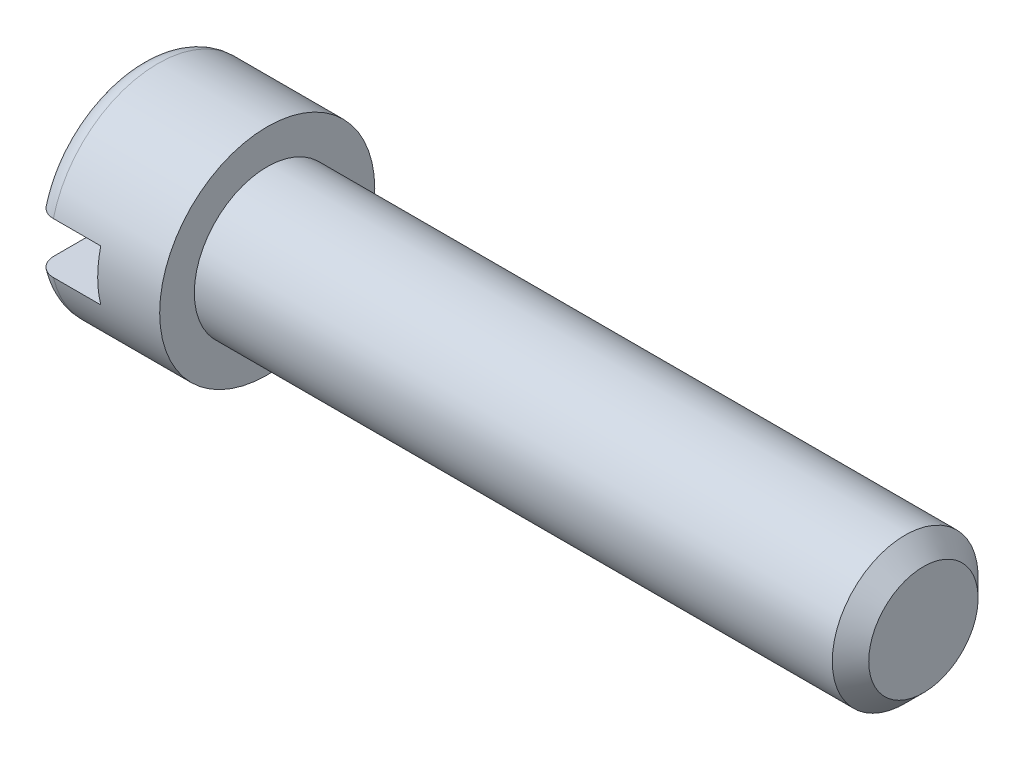
ISO-10303-21;
HEADER;
FILE_DESCRIPTION(('STEP AP214'),'2;1');
FILE_NAME('part.step','',(''),(''),'','','');
FILE_SCHEMA(('AUTOMOTIVE_DESIGN { 1 0 10303 214 1 1 1 1 }'));
ENDSEC;
DATA;
#1=APPLICATION_CONTEXT('core data for automotive mechanical design processes');
#2=APPLICATION_PROTOCOL_DEFINITION('international standard','automotive_design',2000,#1);
#3=PRODUCT_CONTEXT('',#1,'mechanical');
#4=PRODUCT('Part','Part','',(#3));
#5=PRODUCT_RELATED_PRODUCT_CATEGORY('part','',(#4));
#6=PRODUCT_DEFINITION_FORMATION('','',#4);
#7=PRODUCT_DEFINITION_CONTEXT('part definition',#1,'design');
#8=PRODUCT_DEFINITION('design','',#6,#7);
#9=PRODUCT_DEFINITION_SHAPE('','',#8);
#10=(LENGTH_UNIT() NAMED_UNIT(*) SI_UNIT(.MILLI.,.METRE.));
#11=(NAMED_UNIT(*) PLANE_ANGLE_UNIT() SI_UNIT($,.RADIAN.));
#12=(NAMED_UNIT(*) SI_UNIT($,.STERADIAN.) SOLID_ANGLE_UNIT());
#13=UNCERTAINTY_MEASURE_WITH_UNIT(LENGTH_MEASURE(1.E-05),#10,'distance_accuracy_value','');
#14=(GEOMETRIC_REPRESENTATION_CONTEXT(3) GLOBAL_UNCERTAINTY_ASSIGNED_CONTEXT((#13)) GLOBAL_UNIT_ASSIGNED_CONTEXT((#10,
#11,#12)) REPRESENTATION_CONTEXT('',''));
#15=CARTESIAN_POINT('',(0.,0.,0.));
#16=DIRECTION('',(0.,0.,1.));
#17=DIRECTION('',(1.,0.,0.));
#18=AXIS2_PLACEMENT_3D('',#15,#16,#17);
#19=CARTESIAN_POINT('',(-21.5,2.95,0.));
#20=DIRECTION('',(1.,0.,0.));
#21=DIRECTION('',(0.,0.,-1.));
#22=AXIS2_PLACEMENT_3D('',#19,#20,#21);
#23=PLANE('',#22);
#24=CARTESIAN_POINT('',(-21.5,0.,0.));
#25=DIRECTION('',(1.,0.,0.));
#26=DIRECTION('',(0.,0.,-1.));
#27=AXIS2_PLACEMENT_3D('',#24,#25,#26);
#28=CIRCLE('',#27,2.45);
#29=CARTESIAN_POINT('',(-21.5,0.7,2.34787137637478));
#30=VERTEX_POINT('',#29);
#31=CARTESIAN_POINT('',(-21.5,0.7,-2.34787137637655));
#32=VERTEX_POINT('',#31);
#33=EDGE_CURVE('E130',#30,#32,#28,.F.);
#34=ORIENTED_EDGE('',*,*,#33,.T.);
#35=DIRECTION('',(0.,0.,1.));
#36=VECTOR('',#35,1.);
#37=CARTESIAN_POINT('',(-21.5,0.7,-2.95));
#38=LINE('',#37,#36);
#39=EDGE_CURVE('E113',#32,#30,#38,.T.);
#40=ORIENTED_EDGE('',*,*,#39,.T.);
#41=EDGE_LOOP('',(#34,#40));
#42=FACE_BOUND('',#41,.T.);
#43=ADVANCED_FACE('F36',(#42),#23,.F.);
#44=CARTESIAN_POINT('',(-21.,0.,0.));
#45=DIRECTION('',(1.,0.,0.));
#46=DIRECTION('',(0.,0.,-1.));
#47=AXIS2_PLACEMENT_3D('',#44,#45,#46);
#48=TOROIDAL_SURFACE('',#47,2.45,0.5);
#49=CARTESIAN_POINT('',(-21.3395323476872,0.7,-2.72868282056212));
#50=CARTESIAN_POINT('',(-21.3194307837538,0.7,-2.74787857352715));
#51=CARTESIAN_POINT('',(-21.2977272761185,0.7,-2.76542091601088));
#52=CARTESIAN_POINT('',(-21.2516791558268,0.7,-2.79664650662874));
#53=CARTESIAN_POINT('',(-21.2273322587648,0.7,-2.81032637948368));
#54=CARTESIAN_POINT('',(-21.1766614029984,0.7,-2.83338291517071));
#55=CARTESIAN_POINT('',(-21.1503365433846,0.7,-2.84275760311003));
#56=CARTESIAN_POINT('',(-21.0964786974651,0.7,-2.85688232263212));
#57=CARTESIAN_POINT('',(-21.0689459798093,0.7,-2.86163337720094));
#58=CARTESIAN_POINT('',(-21.0138479143806,0.7,-2.86632433666586));
#59=CARTESIAN_POINT('',(-20.9862879941449,0.7,-2.86632814002665));
#60=CARTESIAN_POINT('',(-20.9315634946885,0.7,-2.86168448167034));
#61=CARTESIAN_POINT('',(-20.9043989068567,0.7,-2.85703712141773));
#62=CARTESIAN_POINT('',(-20.8513626771104,0.7,-2.84327486888603));
#63=CARTESIAN_POINT('',(-20.8254856253772,0.7,-2.83418078604609));
#64=CARTESIAN_POINT('',(-20.7756021868275,0.7,-2.81182333639531));
#65=CARTESIAN_POINT('',(-20.751595852723,0.7,-2.79855985215439));
#66=CARTESIAN_POINT('',(-20.7058367865334,0.7,-2.7681035815624));
#67=CARTESIAN_POINT('',(-20.6841119804118,0.7,-2.75086887526299));
#68=CARTESIAN_POINT('',(-20.6437788213491,0.7,-2.7130765153823));
#69=CARTESIAN_POINT('',(-20.6251707754391,0.7,-2.69251853481769));
#70=CARTESIAN_POINT('',(-20.59109996563,0.7,-2.64813478674737));
#71=CARTESIAN_POINT('',(-20.5757255841669,0.7,-2.62424121288317));
#72=CARTESIAN_POINT('',(-20.5490593985457,0.7,-2.57427711391345));
#73=CARTESIAN_POINT('',(-20.5377682158271,0.7,-2.54820625818074));
#74=CARTESIAN_POINT('',(-20.5191923460456,0.7,-2.49371427692626));
#75=CARTESIAN_POINT('',(-20.5120517543118,0.7,-2.4652440388772));
#76=CARTESIAN_POINT('',(-20.5024864012886,0.7,-2.40752257561004));
#77=CARTESIAN_POINT('',(-20.5000624687108,0.7,-2.37827121406452));
#78=CARTESIAN_POINT('',(-20.4999379414336,0.7,-2.31880749672026));
#79=CARTESIAN_POINT('',(-20.5023932055817,0.7,-2.28859476497083));
#80=CARTESIAN_POINT('',(-20.5122429138957,0.7,-2.2289830650535));
#81=CARTESIAN_POINT('',(-20.5196381228431,0.7,-2.19958422362273));
#82=CARTESIAN_POINT('',(-20.5393551261286,0.7,-2.14187892307388));
#83=CARTESIAN_POINT('',(-20.5517649428374,0.7,-2.11360245959055));
#84=CARTESIAN_POINT('',(-20.5812082576796,0.7,-2.05956201885381));
#85=CARTESIAN_POINT('',(-20.5982418986823,0.7,-2.03379811926829));
#86=CARTESIAN_POINT('',(-20.6362968024832,0.7,-1.98589654828779));
#87=CARTESIAN_POINT('',(-20.6572683495468,0.7,-1.96371947550884));
#88=CARTESIAN_POINT('',(-20.7028035506186,0.7,-1.92341714148615));
#89=CARTESIAN_POINT('',(-20.7273661616196,0.7,-1.90529070760594));
#90=CARTESIAN_POINT('',(-20.7781359932806,0.7,-1.87459150288935));
#91=CARTESIAN_POINT('',(-20.8042062470927,0.7,-1.86179255921855));
#92=CARTESIAN_POINT('',(-20.8582209742639,0.7,-1.84108607637963));
#93=CARTESIAN_POINT('',(-20.8861645570407,0.7,-1.83317623095359));
#94=CARTESIAN_POINT('',(-20.9412667375179,0.7,-1.82294634529363));
#95=CARTESIAN_POINT('',(-20.9683670413763,0.7,-1.82031092188374));
#96=CARTESIAN_POINT('',(-21.0226107224124,0.7,-1.81978763047455));
#97=CARTESIAN_POINT('',(-21.0497540892797,0.7,-1.82189875950374));
#98=CARTESIAN_POINT('',(-21.1024411701321,0.7,-1.83063455552979));
#99=CARTESIAN_POINT('',(-21.1280084118403,0.7,-1.83711871814403));
#100=CARTESIAN_POINT('',(-21.1777290115261,0.7,-1.85419393618837));
#101=CARTESIAN_POINT('',(-21.2018822576405,0.7,-1.86478531604244));
#102=CARTESIAN_POINT('',(-21.248707961427,0.7,-1.88997221154755));
#103=CARTESIAN_POINT('',(-21.2713343024807,0.7,-1.90465324106722));
#104=CARTESIAN_POINT('',(-21.3139740195708,0.7,-1.93741238017284));
#105=CARTESIAN_POINT('',(-21.3339867571356,0.7,-1.95549131720499));
#106=CARTESIAN_POINT('',(-21.3720427680048,0.7,-1.99562523344564));
#107=CARTESIAN_POINT('',(-21.3899091209776,0.7,-2.01784794598396));
#108=CARTESIAN_POINT('',(-21.4218892928628,0.7,-2.06484639141047));
#109=CARTESIAN_POINT('',(-21.4360020780751,0.7,-2.08962282497018));
#110=CARTESIAN_POINT('',(-21.460845982988,0.7,-2.14248329174338));
#111=CARTESIAN_POINT('',(-21.4713504434774,0.7,-2.17067405099914));
#112=CARTESIAN_POINT('',(-21.487612960069,0.7,-2.22839362334481));
#113=CARTESIAN_POINT('',(-21.4933703774415,0.7,-2.25792261593453));
#114=CARTESIAN_POINT('',(-21.5000616186658,0.7,-2.31828925455976));
#115=CARTESIAN_POINT('',(-21.5008686974227,0.7,-2.34914107004229));
#116=CARTESIAN_POINT('',(-21.497249836884,0.7,-2.41054750998412));
#117=CARTESIAN_POINT('',(-21.49282262201,0.7,-2.44110206017111));
#118=CARTESIAN_POINT('',(-21.4788445237946,0.7,-2.5007728724454));
#119=CARTESIAN_POINT('',(-21.4693326607225,0.7,-2.52989826776312));
#120=CARTESIAN_POINT('',(-21.445410817045,0.7,-2.58603649647397));
#121=CARTESIAN_POINT('',(-21.4310075523434,0.7,-2.6130521643048));
#122=CARTESIAN_POINT('',(-21.4036537934208,0.7,-2.65495884096308));
#123=CARTESIAN_POINT('',(-21.3920276494582,0.7,-2.67072929420983));
#124=CARTESIAN_POINT('',(-21.367043095561,0.7,-2.70083392510903));
#125=CARTESIAN_POINT('',(-21.3536847464581,0.7,-2.71516815316757));
#126=CARTESIAN_POINT('',(-21.3395323476872,0.7,-2.72868282056212));
#127=B_SPLINE_CURVE_WITH_KNOTS('',3,(#49,#50,#51,#52,#53,#54,#55,#56,#57,#58,#59,#60,#61,#62,
#63,#64,#65,#66,#67,#68,#69,#70,#71,#72,#73,#74,#75,#76,#77,#78,#79,#80,#81,#82,#83,#84,#85,#86,
#87,#88,#89,#90,#91,#92,#93,#94,#95,#96,#97,#98,#99,#100,#101,#102,#103,#104,#105,#106,#107,
#108,#109,#110,#111,#112,#113,#114,#115,#116,#117,#118,#119,#120,#121,#122,#123,#124,#125,#126),
.UNSPECIFIED.,.T.,.F.,(4,2,2,2,2,2,2,2,2,2,2,2,2,2,2,2,2,2,2,2,2,2,2,2,2,2,2,2,2,2,2,2,2,2,2,2,
2,2,4),(0.,0.0833151889056845,0.166702960327436,0.250128945627075,0.333536468598735,
0.415821305896837,0.498104348201658,0.580005961396093,0.66190988153438,0.744721558255947,
0.82754138794216,0.9123934373738,0.99725839537023,1.08491648135421,1.17258996737119,
1.26310907103304,1.35364219173033,1.44583872795775,1.53803811324442,1.62914345549601,
1.72022238901315,1.80689698993791,1.89353067394227,1.97480771355881,2.05606758052315,
2.13483366126801,2.21360596491476,2.29416813532614,2.3747499494256,2.45991809014058,
2.54510966119565,2.63495178871342,2.72480600280366,2.81695149407557,2.9091194455013,
3.00059003359859,3.09193553677371,3.15059521018248,3.20925282413626),.UNSPECIFIED.);
#128=CARTESIAN_POINT('',(-21.0000000000001,0.7,-2.86574597618171));
#129=VERTEX_POINT('',#128);
#130=EDGE_CURVE('E59',#32,#129,#127,.T.);
#131=ORIENTED_EDGE('',*,*,#130,.F.);
#132=ORIENTED_EDGE('',*,*,#33,.F.);
#133=CARTESIAN_POINT('',(-21.089826393622,0.7,1.82874069125799));
#134=CARTESIAN_POINT('',(-21.0638941866123,0.7,1.82367114326781));
#135=CARTESIAN_POINT('',(-21.0375170439311,0.7,1.82078809255617));
#136=CARTESIAN_POINT('',(-20.9846391264482,0.7,1.81952985840892));
#137=CARTESIAN_POINT('',(-20.9581382620986,0.7,1.82115871335275));
#138=CARTESIAN_POINT('',(-20.9058170419438,0.7,1.82885572118953));
#139=CARTESIAN_POINT('',(-20.8799960412812,0.7,1.83491949789685));
#140=CARTESIAN_POINT('',(-20.829720580569,0.7,1.85123248058482));
#141=CARTESIAN_POINT('',(-20.8052660440476,0.7,1.86148145208113));
#142=CARTESIAN_POINT('',(-20.7579790608311,0.7,1.88596502576302));
#143=CARTESIAN_POINT('',(-20.7351765126615,0.7,1.90025720769797));
#144=CARTESIAN_POINT('',(-20.6921273567343,0.7,1.93227398227393));
#145=CARTESIAN_POINT('',(-20.6718813517706,0.7,1.94999938192817));
#146=CARTESIAN_POINT('',(-20.6333077126354,0.7,1.9894345417483));
#147=CARTESIAN_POINT('',(-20.6151517858165,0.7,2.01131221419429));
#148=CARTESIAN_POINT('',(-20.5825379806424,0.7,2.05766886707236));
#149=CARTESIAN_POINT('',(-20.5680811404062,0.7,2.08214857502269));
#150=CARTESIAN_POINT('',(-20.5424690684227,0.7,2.13447745833185));
#151=CARTESIAN_POINT('',(-20.5315414003752,0.7,2.16243820804652));
#152=CARTESIAN_POINT('',(-20.5143916432529,0.7,2.21976903361462));
#153=CARTESIAN_POINT('',(-20.5081703861676,0.7,2.24913935767422));
#154=CARTESIAN_POINT('',(-20.500500159442,0.7,2.30931718977685));
#155=CARTESIAN_POINT('',(-20.499186202819,0.7,2.34014204049858));
#156=CARTESIAN_POINT('',(-20.5017855195656,0.7,2.40157345242899));
#157=CARTESIAN_POINT('',(-20.5056988278809,0.7,2.43218001217696));
#158=CARTESIAN_POINT('',(-20.5186671379809,0.7,2.49207637300488));
#159=CARTESIAN_POINT('',(-20.5276880497479,0.7,2.52137352872421));
#160=CARTESIAN_POINT('',(-20.5506655608881,0.7,2.57796664121073));
#161=CARTESIAN_POINT('',(-20.5646214508813,0.7,2.60526288491918));
#162=CARTESIAN_POINT('',(-20.5966557287484,0.7,2.6562222051277));
#163=CARTESIAN_POINT('',(-20.6146031871926,0.7,2.67996753756022));
#164=CARTESIAN_POINT('',(-20.6543623013364,0.7,2.72396855918151));
#165=CARTESIAN_POINT('',(-20.6761731775773,0.7,2.74422495065411));
#166=CARTESIAN_POINT('',(-20.7222160456451,0.7,2.7799227465911));
#167=CARTESIAN_POINT('',(-20.7463367786237,0.7,2.79550769060097));
#168=CARTESIAN_POINT('',(-20.7969118462113,0.7,2.82226795625665));
#169=CARTESIAN_POINT('',(-20.8233657683122,0.7,2.83344405548203));
#170=CARTESIAN_POINT('',(-20.877042298006,0.7,2.85075417451028));
#171=CARTESIAN_POINT('',(-20.9042216038308,0.7,2.85702263579961));
#172=CARTESIAN_POINT('',(-20.9592505812763,0.7,2.86482979913505));
#173=CARTESIAN_POINT('',(-20.9871001813064,0.7,2.86636900404947));
#174=CARTESIAN_POINT('',(-21.0422317825662,0.7,2.86468011066848));
#175=CARTESIAN_POINT('',(-21.0695160088948,0.7,2.86152357257875));
#176=CARTESIAN_POINT('',(-21.1231664042162,0.7,2.85067678922464));
#177=CARTESIAN_POINT('',(-21.1495325946432,0.7,2.84298664988538));
#178=CARTESIAN_POINT('',(-21.200631487854,0.7,2.82331119012339));
#179=CARTESIAN_POINT('',(-21.2253629157891,0.7,2.81132256331025));
#180=CARTESIAN_POINT('',(-21.2725042181886,0.7,2.78342594128265));
#181=CARTESIAN_POINT('',(-21.2949139633433,0.7,2.7675177279275));
#182=CARTESIAN_POINT('',(-21.3371738563963,0.7,2.7319781220664));
#183=CARTESIAN_POINT('',(-21.3569772096004,0.7,2.71229112898305));
#184=CARTESIAN_POINT('',(-21.3931059690982,0.7,2.66995203961548));
#185=CARTESIAN_POINT('',(-21.4094309639907,0.7,2.64729959310463));
#186=CARTESIAN_POINT('',(-21.4386384451672,0.7,2.59899993374985));
#187=CARTESIAN_POINT('',(-21.4514112722165,0.7,2.57328644100231));
#188=CARTESIAN_POINT('',(-21.472619138679,0.7,2.52013026789535));
#189=CARTESIAN_POINT('',(-21.4810534563954,0.7,2.49268730069524));
#190=CARTESIAN_POINT('',(-21.4936441741993,0.7,2.43585748258088));
#191=CARTESIAN_POINT('',(-21.4976455002529,0.7,2.40643626571619));
#192=CARTESIAN_POINT('',(-21.500805562076,0.7,2.34733467110137));
#193=CARTESIAN_POINT('',(-21.4999634535874,0.7,2.31765424906958));
#194=CARTESIAN_POINT('',(-21.4934015190102,0.7,2.25794992027348));
#195=CARTESIAN_POINT('',(-21.4875387054062,0.7,2.22794165989663));
#196=CARTESIAN_POINT('',(-21.4709120247252,0.7,2.16931232092042));
#197=CARTESIAN_POINT('',(-21.4601476890242,0.7,2.14069137524883));
#198=CARTESIAN_POINT('',(-21.4338520995109,0.7,2.08538283795689));
#199=CARTESIAN_POINT('',(-21.4182755706642,0.7,2.05871671943311));
#200=CARTESIAN_POINT('',(-21.3827563321863,0.7,2.00845129202553));
#201=CARTESIAN_POINT('',(-21.3628127354621,0.7,1.98485260779144));
#202=CARTESIAN_POINT('',(-21.3195913190517,0.7,1.94207560327021));
#203=CARTESIAN_POINT('',(-21.2964055695536,0.7,1.92280435773701));
#204=CARTESIAN_POINT('',(-21.2469830209182,0.7,1.8887323578478));
#205=CARTESIAN_POINT('',(-21.2207516429712,0.7,1.87392382390311));
#206=CARTESIAN_POINT('',(-21.1768320297312,0.7,1.85423890376939));
#207=CARTESIAN_POINT('',(-21.1598506969167,0.7,1.84774819023773));
#208=CARTESIAN_POINT('',(-21.1252583985586,0.7,1.83674106812322));
#209=CARTESIAN_POINT('',(-21.1076474605111,0.7,1.83222457343572));
#210=CARTESIAN_POINT('',(-21.089826393622,0.7,1.82874069125799));
#211=B_SPLINE_CURVE_WITH_KNOTS('',3,(#133,#134,#135,#136,#137,#138,#139,#140,#141,#142,#143,
#144,#145,#146,#147,#148,#149,#150,#151,#152,#153,#154,#155,#156,#157,#158,#159,#160,#161,#162,
#163,#164,#165,#166,#167,#168,#169,#170,#171,#172,#173,#174,#175,#176,#177,#178,#179,#180,#181,
#182,#183,#184,#185,#186,#187,#188,#189,#190,#191,#192,#193,#194,#195,#196,#197,#198,#199,#200,
#201,#202,#203,#204,#205,#206,#207,#208,#209,#210),.UNSPECIFIED.,.T.,.F.,(4,2,2,2,2,2,2,2,2,2,2,
2,2,2,2,2,2,2,2,2,2,2,2,2,2,2,2,2,2,2,2,2,2,2,2,2,2,2,4),(0.,0.0792027395545826,
0.158476392391952,0.237671926834172,0.316863024788417,0.397244170539657,0.477644233688257,
0.562561804991983,0.647503181659748,0.737155233494773,0.826823130130588,0.918940590361569,
1.01105866642423,1.10256904030007,1.19406626533137,1.28291674929955,1.37174932772957,
1.45747723413869,1.54319001411282,1.62646348172795,1.70972809445436,1.79173673644564,
1.87374346242572,1.9558134036663,2.03788791345998,2.12127822591127,2.2046783958437,
2.29042276785905,2.37618139856129,2.46485360880836,2.55354127595886,2.64484206411412,
2.73615158317675,2.82834778108,2.9205627244222,3.01055245484003,3.100384391599,3.15481627580568,
3.20924578575346),.UNSPECIFIED.);
#212=CARTESIAN_POINT('',(-21.,0.7,2.86574597618142));
#213=VERTEX_POINT('',#212);
#214=EDGE_CURVE('E159',#213,#30,#211,.T.);
#215=ORIENTED_EDGE('',*,*,#214,.F.);
#216=CARTESIAN_POINT('',(-21.,0.,0.));
#217=DIRECTION('',(1.,0.,0.));
#218=DIRECTION('',(0.,0.,-1.));
#219=AXIS2_PLACEMENT_3D('',#216,#217,#218);
#220=CIRCLE('',#219,2.95);
#221=EDGE_CURVE('E135',#129,#213,#220,.T.);
#222=ORIENTED_EDGE('',*,*,#221,.F.);
#223=EDGE_LOOP('',(#131,#132,#215,#222));
#224=FACE_BOUND('',#223,.T.);
#225=ADVANCED_FACE('F177',(#224),#48,.T.);
#226=CARTESIAN_POINT('',(0.,0.,0.));
#227=DIRECTION('',(-1.,0.,0.));
#228=DIRECTION('',(0.,0.,1.));
#229=AXIS2_PLACEMENT_3D('',#226,#227,#228);
#230=PLANE('',#229);
#231=CARTESIAN_POINT('',(0.,0.,0.));
#232=DIRECTION('',(-1.,0.,0.));
#233=DIRECTION('',(0.,0.,1.));
#234=AXIS2_PLACEMENT_3D('',#231,#232,#233);
#235=CIRCLE('',#234,1.5);
#236=CARTESIAN_POINT('',(0.,0.,1.5));
#237=VERTEX_POINT('',#236);
#238=EDGE_CURVE('E127',#237,#237,#235,.F.);
#239=ORIENTED_EDGE('',*,*,#238,.T.);
#240=EDGE_LOOP('',(#239));
#241=FACE_BOUND('',#240,.T.);
#242=ADVANCED_FACE('F38',(#241),#230,.F.);
#243=CARTESIAN_POINT('',(-6.,0.,0.));
#244=DIRECTION('',(-1.,0.,0.));
#245=DIRECTION('',(0.,0.,1.));
#246=AXIS2_PLACEMENT_3D('',#243,#244,#245);
#247=CYLINDRICAL_SURFACE('',#246,2.);
#248=CARTESIAN_POINT('',(-0.500000000000002,0.,0.));
#249=DIRECTION('',(-1.,0.,0.));
#250=DIRECTION('',(0.,0.,1.));
#251=AXIS2_PLACEMENT_3D('',#248,#249,#250);
#252=CIRCLE('',#251,2.);
#253=CARTESIAN_POINT('',(-0.500000000000002,0.,2.));
#254=VERTEX_POINT('',#253);
#255=EDGE_CURVE('E124',#254,#254,#252,.T.);
#256=ORIENTED_EDGE('',*,*,#255,.T.);
#257=EDGE_LOOP('',(#256));
#258=FACE_BOUND('',#257,.T.);
#259=CARTESIAN_POINT('',(-18.,0.,0.));
#260=DIRECTION('',(-1.,0.,0.));
#261=DIRECTION('',(0.,0.,1.));
#262=AXIS2_PLACEMENT_3D('',#259,#260,#261);
#263=CIRCLE('',#262,2.);
#264=CARTESIAN_POINT('',(-18.,0.,2.));
#265=VERTEX_POINT('',#264);
#266=EDGE_CURVE('E121',#265,#265,#263,.T.);
#267=ORIENTED_EDGE('',*,*,#266,.F.);
#268=EDGE_LOOP('',(#267));
#269=FACE_BOUND('',#268,.T.);
#270=ADVANCED_FACE('F184',(#258,#269),#247,.T.);
#271=CARTESIAN_POINT('',(-18.,2.,0.));
#272=DIRECTION('',(-1.,0.,0.));
#273=DIRECTION('',(0.,0.,1.));
#274=AXIS2_PLACEMENT_3D('',#271,#272,#273);
#275=PLANE('',#274);
#276=CARTESIAN_POINT('',(-18.,0.,0.));
#277=DIRECTION('',(-1.,0.,0.));
#278=DIRECTION('',(0.,0.,1.));
#279=AXIS2_PLACEMENT_3D('',#276,#277,#278);
#280=CIRCLE('',#279,2.95);
#281=CARTESIAN_POINT('',(-18.,0.,2.95));
#282=VERTEX_POINT('',#281);
#283=EDGE_CURVE('E118',#282,#282,#280,.T.);
#284=ORIENTED_EDGE('',*,*,#283,.F.);
#285=EDGE_LOOP('',(#284));
#286=FACE_BOUND('',#285,.T.);
#287=ORIENTED_EDGE('',*,*,#266,.T.);
#288=EDGE_LOOP('',(#287));
#289=FACE_BOUND('',#288,.T.);
#290=ADVANCED_FACE('F201',(#286,#289),#275,.F.);
#291=CARTESIAN_POINT('',(-6.,0.,0.));
#292=DIRECTION('',(-1.,0.,0.));
#293=DIRECTION('',(0.,0.,1.));
#294=AXIS2_PLACEMENT_3D('',#291,#292,#293);
#295=CYLINDRICAL_SURFACE('',#294,2.95);
#296=CARTESIAN_POINT('',(-19.7,0.,0.));
#297=DIRECTION('',(1.,0.,0.));
#298=DIRECTION('',(0.,0.,-1.));
#299=AXIS2_PLACEMENT_3D('',#296,#297,#298);
#300=CIRCLE('',#299,2.95);
#301=CARTESIAN_POINT('',(-19.7,-0.7,-2.86574597618142));
#302=VERTEX_POINT('',#301);
#303=CARTESIAN_POINT('',(-19.7,0.7,-2.86574597618142));
#304=VERTEX_POINT('',#303);
#305=EDGE_CURVE('E11',#302,#304,#300,.T.);
#306=ORIENTED_EDGE('',*,*,#305,.T.);
#307=DIRECTION('',(-1.,0.,0.));
#308=VECTOR('',#307,1.);
#309=CARTESIAN_POINT('',(-6.,0.7,-2.86574597618142));
#310=LINE('',#309,#308);
#311=EDGE_CURVE('E111',#304,#129,#310,.T.);
#312=ORIENTED_EDGE('',*,*,#311,.T.);
#313=ORIENTED_EDGE('',*,*,#221,.T.);
#314=DIRECTION('',(-1.,0.,0.));
#315=VECTOR('',#314,1.);
#316=CARTESIAN_POINT('',(-6.,0.7,2.86574597618142));
#317=LINE('',#316,#315);
#318=CARTESIAN_POINT('',(-19.7,0.7,2.86574597618142));
#319=VERTEX_POINT('',#318);
#320=EDGE_CURVE('E108',#213,#319,#317,.F.);
#321=ORIENTED_EDGE('',*,*,#320,.T.);
#322=CARTESIAN_POINT('',(-19.7,-0.7,2.86574597618142));
#323=VERTEX_POINT('',#322);
#324=EDGE_CURVE('E40',#319,#323,#300,.T.);
#325=ORIENTED_EDGE('',*,*,#324,.T.);
#326=DIRECTION('',(-1.,0.,0.));
#327=VECTOR('',#326,1.);
#328=CARTESIAN_POINT('',(-6.,-0.7,2.86574597618142));
#329=LINE('',#328,#327);
#330=CARTESIAN_POINT('',(-20.9999999999998,-0.7,2.86574597618253));
#331=VERTEX_POINT('',#330);
#332=EDGE_CURVE('E101',#323,#331,#329,.T.);
#333=ORIENTED_EDGE('',*,*,#332,.T.);
#334=CARTESIAN_POINT('',(-20.9999999999998,-0.7,-2.86574597618241));
#335=VERTEX_POINT('',#334);
#336=EDGE_CURVE('E107',#331,#335,#220,.T.);
#337=ORIENTED_EDGE('',*,*,#336,.T.);
#338=DIRECTION('',(-1.,0.,0.));
#339=VECTOR('',#338,1.);
#340=CARTESIAN_POINT('',(-6.,-0.7,-2.86574597618142));
#341=LINE('',#340,#339);
#342=EDGE_CURVE('E98',#335,#302,#341,.F.);
#343=ORIENTED_EDGE('',*,*,#342,.T.);
#344=EDGE_LOOP('',(#306,#312,#313,#321,#325,#333,#337,#343));
#345=FACE_BOUND('',#344,.T.);
#346=ORIENTED_EDGE('',*,*,#283,.T.);
#347=EDGE_LOOP('',(#346));
#348=FACE_BOUND('',#347,.T.);
#349=ADVANCED_FACE('F104',(#345,#348),#295,.T.);
#350=CARTESIAN_POINT('',(-21.5,-0.7,-2.34787137637388));
#351=VERTEX_POINT('',#350);
#352=CARTESIAN_POINT('',(-21.5,-0.7,2.34787137637478));
#353=VERTEX_POINT('',#352);
#354=EDGE_CURVE('E131',#351,#353,#28,.F.);
#355=ORIENTED_EDGE('',*,*,#354,.T.);
#356=DIRECTION('',(0.,0.,1.));
#357=VECTOR('',#356,1.);
#358=CARTESIAN_POINT('',(-21.5,-0.7,-2.95));
#359=LINE('',#358,#357);
#360=EDGE_CURVE('E51',#351,#353,#359,.T.);
#361=ORIENTED_EDGE('',*,*,#360,.F.);
#362=EDGE_LOOP('',(#355,#361));
#363=FACE_BOUND('',#362,.T.);
#364=ADVANCED_FACE('F169',(#363),#23,.F.);
#365=CARTESIAN_POINT('',(-0.500000000000002,0.,0.));
#366=DIRECTION('',(-1.,0.,0.));
#367=DIRECTION('',(0.,0.,1.));
#368=AXIS2_PLACEMENT_3D('',#365,#366,#367);
#369=CONICAL_SURFACE('',#368,2.,0.785398163397447);
#370=ORIENTED_EDGE('',*,*,#238,.F.);
#371=EDGE_LOOP('',(#370));
#372=FACE_BOUND('',#371,.T.);
#373=ORIENTED_EDGE('',*,*,#255,.F.);
#374=EDGE_LOOP('',(#373));
#375=FACE_BOUND('',#374,.T.);
#376=ADVANCED_FACE('F188',(#372,#375),#369,.T.);
#377=CARTESIAN_POINT('',(-21.3395323476872,-0.7,-2.72868282056212));
#378=CARTESIAN_POINT('',(-21.3605464456769,-0.7,-2.7086120212581));
#379=CARTESIAN_POINT('',(-21.3798408236034,-0.7,-2.68670288461082));
#380=CARTESIAN_POINT('',(-21.4144593628447,-0.7,-2.63991302187431));
#381=CARTESIAN_POINT('',(-21.4297770440747,-0.7,-2.61502754096451));
#382=CARTESIAN_POINT('',(-21.4560303475647,-0.7,-2.56310586238075));
#383=CARTESIAN_POINT('',(-21.466974468195,-0.7,-2.53607395926461));
#384=CARTESIAN_POINT('',(-21.4842956684764,-0.7,-2.48059834494624));
#385=CARTESIAN_POINT('',(-21.4906739338359,-0.7,-2.45215500233433));
#386=CARTESIAN_POINT('',(-21.4988769520162,-0.7,-2.39385486471033));
#387=CARTESIAN_POINT('',(-21.5005773197024,-0.7,-2.36398057358289));
#388=CARTESIAN_POINT('',(-21.4990778062914,-0.7,-2.30435251875371));
#389=CARTESIAN_POINT('',(-21.4958768327529,-0.7,-2.27459878340432));
#390=CARTESIAN_POINT('',(-21.4845347629762,-0.7,-2.21523141874791));
#391=CARTESIAN_POINT('',(-21.476265620807,-0.7,-2.18564217437633));
#392=CARTESIAN_POINT('',(-21.4548938946718,-0.7,-2.12825904559643));
#393=CARTESIAN_POINT('',(-21.4417908189074,-0.7,-2.1004653442027));
#394=CARTESIAN_POINT('',(-21.4110221729413,-0.7,-2.04742435161519));
#395=CARTESIAN_POINT('',(-21.3933446103182,-0.7,-2.0221839998892));
#396=CARTESIAN_POINT('',(-21.353866941993,-0.7,-1.97515631010048));
#397=CARTESIAN_POINT('',(-21.3320674114008,-0.7,-1.95336849110819));
#398=CARTESIAN_POINT('',(-21.2857068432784,-0.7,-1.91471446905947));
#399=CARTESIAN_POINT('',(-21.2612638865645,-0.7,-1.89770693926839));
#400=CARTESIAN_POINT('',(-21.2097226773471,-0.7,-1.8683514633525));
#401=CARTESIAN_POINT('',(-21.1826256267265,-0.7,-1.85600142030295));
#402=CARTESIAN_POINT('',(-21.1283284594494,-0.7,-1.83711784835219));
#403=CARTESIAN_POINT('',(-21.1012359016612,-0.7,-1.83027490640679));
#404=CARTESIAN_POINT('',(-21.0462693144958,-0.7,-1.82149749716854));
#405=CARTESIAN_POINT('',(-21.0183955647358,-0.7,-1.81956129569869));
#406=CARTESIAN_POINT('',(-20.9641151648518,-0.7,-1.82065655705712));
#407=CARTESIAN_POINT('',(-20.937703368356,-0.7,-1.82344994824601));
#408=CARTESIAN_POINT('',(-20.8857275535363,-0.7,-1.83343376649581));
#409=CARTESIAN_POINT('',(-20.8601635130759,-0.7,-1.84062407864928));
#410=CARTESIAN_POINT('',(-20.8105629302657,-0.7,-1.85911647016737));
#411=CARTESIAN_POINT('',(-20.7865270483748,-0.7,-1.87042031336882));
#412=CARTESIAN_POINT('',(-20.7405773512116,-0.7,-1.89672831441139));
#413=CARTESIAN_POINT('',(-20.71866393655,-0.7,-1.91173316892158));
#414=CARTESIAN_POINT('',(-20.6764731550963,-0.7,-1.94574050777362));
#415=CARTESIAN_POINT('',(-20.6563200682295,-0.7,-1.96489701791975));
#416=CARTESIAN_POINT('',(-20.6192917238462,-0.7,-2.00615036508916));
#417=CARTESIAN_POINT('',(-20.6024173781589,-0.7,-2.02824801718334));
#418=CARTESIAN_POINT('',(-20.5713802109367,-0.7,-2.07617778561887));
#419=CARTESIAN_POINT('',(-20.5574400857697,-0.7,-2.10215424784234));
#420=CARTESIAN_POINT('',(-20.5339245349137,-0.7,-2.15601387513546));
#421=CARTESIAN_POINT('',(-20.5243501061583,-0.7,-2.18389747404144));
#422=CARTESIAN_POINT('',(-20.5094996882874,-0.7,-2.24197261534288));
#423=CARTESIAN_POINT('',(-20.5044094247032,-0.7,-2.27221183579763));
#424=CARTESIAN_POINT('',(-20.4993451885311,-0.7,-2.33311832182955));
#425=CARTESIAN_POINT('',(-20.4993715928674,-0.7,-2.36378561877497));
#426=CARTESIAN_POINT('',(-20.5046044534529,-0.7,-2.42484452070928));
#427=CARTESIAN_POINT('',(-20.5098385578577,-0.7,-2.4552337804703));
#428=CARTESIAN_POINT('',(-20.5254529289567,-0.7,-2.51466306381433));
#429=CARTESIAN_POINT('',(-20.5358326915426,-0.7,-2.5437032192613));
#430=CARTESIAN_POINT('',(-20.5612223674773,-0.7,-2.59889410789743));
#431=CARTESIAN_POINT('',(-20.5761226673367,-0.7,-2.62509520746191));
#432=CARTESIAN_POINT('',(-20.6102596711761,-0.7,-2.67450375621757));
#433=CARTESIAN_POINT('',(-20.6294955539863,-0.7,-2.69771177099918));
#434=CARTESIAN_POINT('',(-20.6710455126882,-0.7,-2.73961833030565));
#435=CARTESIAN_POINT('',(-20.6932306187785,-0.7,-2.75844474674859));
#436=CARTESIAN_POINT('',(-20.7405346417789,-0.7,-2.79195791506943));
#437=CARTESIAN_POINT('',(-20.7656529975194,-0.7,-2.80664545694003));
#438=CARTESIAN_POINT('',(-20.8172414048102,-0.7,-2.83098143296905));
#439=CARTESIAN_POINT('',(-20.8436426419947,-0.7,-2.84077585523816));
#440=CARTESIAN_POINT('',(-20.8977329431715,-0.7,-2.85568773058528));
#441=CARTESIAN_POINT('',(-20.925421776325,-0.7,-2.86080601862435));
#442=CARTESIAN_POINT('',(-20.9806880266126,-0.7,-2.86613868486456));
#443=CARTESIAN_POINT('',(-21.008255925948,-0.7,-2.86645219805462));
#444=CARTESIAN_POINT('',(-21.0630557272255,-0.7,-2.86241895281727));
#445=CARTESIAN_POINT('',(-21.0902875555867,-0.7,-2.85807119151901));
#446=CARTESIAN_POINT('',(-21.1435017392849,-0.7,-2.84488927109378));
#447=CARTESIAN_POINT('',(-21.1694893610221,-0.7,-2.83607627324785));
#448=CARTESIAN_POINT('',(-21.2196131421646,-0.7,-2.81426044397011));
#449=CARTESIAN_POINT('',(-21.2437515960254,-0.7,-2.80126291249125));
#450=CARTESIAN_POINT('',(-21.2796559851953,-0.7,-2.77792767103296));
#451=CARTESIAN_POINT('',(-21.2922669682521,-0.7,-2.76886158049539));
#452=CARTESIAN_POINT('',(-21.3165929460111,-0.7,-2.74959940556325));
#453=CARTESIAN_POINT('',(-21.3283079658141,-0.7,-2.7394033528446));
#454=CARTESIAN_POINT('',(-21.3395323476872,-0.7,-2.72868282056212));
#455=B_SPLINE_CURVE_WITH_KNOTS('',3,(#377,#378,#379,#380,#381,#382,#383,#384,#385,#386,#387,
#388,#389,#390,#391,#392,#393,#394,#395,#396,#397,#398,#399,#400,#401,#402,#403,#404,#405,#406,
#407,#408,#409,#410,#411,#412,#413,#414,#415,#416,#417,#418,#419,#420,#421,#422,#423,#424,#425,
#426,#427,#428,#429,#430,#431,#432,#433,#434,#435,#436,#437,#438,#439,#440,#441,#442,#443,#444,
#445,#446,#447,#448,#449,#450,#451,#452,#453,#454),.UNSPECIFIED.,.T.,.F.,(4,2,2,2,2,2,2,2,2,2,2,
2,2,2,2,2,2,2,2,2,2,2,2,2,2,2,2,2,2,2,2,2,2,2,2,2,2,2,4),(0.,0.0871182519997585,
0.174377585831457,0.261466529762529,0.348532849327236,0.437892859038912,0.527272788762146,
0.619009681812951,0.710755910639427,0.802745140933667,0.894721546062218,0.983592684418184,
1.07242376271311,1.1558245946156,1.23919594625748,1.31849422982148,1.3977904411234,
1.47712069390881,1.55646589103296,1.63951835594094,1.72259388506922,1.81064091152063,
1.89870803399614,1.99027120042019,2.08184111193467,2.17389978458026,2.26594944022811,
2.35592472210382,2.44588297674507,2.53274019107228,2.61958081559623,2.70364726973866,
2.7876987102099,2.87001356052373,2.95234612439079,3.0342921040369,3.1161347000163,
3.16266898069885,3.20920195722905),.UNSPECIFIED.);
#456=EDGE_CURVE('E142',#335,#351,#455,.T.);
#457=ORIENTED_EDGE('',*,*,#456,.F.);
#458=ORIENTED_EDGE('',*,*,#336,.F.);
#459=CARTESIAN_POINT('',(-21.089826393622,-0.7,1.82874069125799));
#460=CARTESIAN_POINT('',(-21.1168185890736,-0.7,1.83402062324525));
#461=CARTESIAN_POINT('',(-21.1433712032588,-0.7,1.84167865984696));
#462=CARTESIAN_POINT('',(-21.1947997249542,-0.7,1.86142953189058));
#463=CARTESIAN_POINT('',(-21.2196727462193,-0.7,1.87352978228697));
#464=CARTESIAN_POINT('',(-21.2669917443516,-0.7,1.9016504541512));
#465=CARTESIAN_POINT('',(-21.2894444783711,-0.7,1.91765953132671));
#466=CARTESIAN_POINT('',(-21.3314778957381,-0.7,1.95306510692104));
#467=CARTESIAN_POINT('',(-21.3510591058008,-0.7,1.9724609826758));
#468=CARTESIAN_POINT('',(-21.3877262126839,-0.7,2.01496525395422));
#469=CARTESIAN_POINT('',(-21.4046684607247,-0.7,2.03819749558184));
#470=CARTESIAN_POINT('',(-21.4346422310898,-0.7,2.08706217747383));
#471=CARTESIAN_POINT('',(-21.4476726119803,-0.7,2.1126953154328));
#472=CARTESIAN_POINT('',(-21.4701172279828,-0.7,2.16706957433095));
#473=CARTESIAN_POINT('',(-21.4793083853174,-0.7,2.19590298091081));
#474=CARTESIAN_POINT('',(-21.4928306832784,-0.7,2.25469003012704));
#475=CARTESIAN_POINT('',(-21.4971610719541,-0.7,2.28464384534787));
#476=CARTESIAN_POINT('',(-21.5008619004043,-0.7,2.34547412505005));
#477=CARTESIAN_POINT('',(-21.5001294263766,-0.7,2.37635695014705));
#478=CARTESIAN_POINT('',(-21.4934252924612,-0.7,2.43755139181011));
#479=CARTESIAN_POINT('',(-21.4874538078591,-0.7,2.46786302745222));
#480=CARTESIAN_POINT('',(-21.4704733918833,-0.7,2.52664280662233));
#481=CARTESIAN_POINT('',(-21.4595269716195,-0.7,2.55512896437786));
#482=CARTESIAN_POINT('',(-21.4328554771228,-0.7,2.60977149658842));
#483=CARTESIAN_POINT('',(-21.4171311713964,-0.7,2.63592824484665));
#484=CARTESIAN_POINT('',(-21.3818693657647,-0.7,2.68428256641159));
#485=CARTESIAN_POINT('',(-21.3624668825585,-0.7,2.70657856152581));
#486=CARTESIAN_POINT('',(-21.3200741896918,-0.7,2.74745119770927));
#487=CARTESIAN_POINT('',(-21.2970847082374,-0.7,2.76602859195779));
#488=CARTESIAN_POINT('',(-21.2490286172653,-0.7,2.79826272681052));
#489=CARTESIAN_POINT('',(-21.2240609532611,-0.7,2.81206704009578));
#490=CARTESIAN_POINT('',(-21.172117049893,-0.7,2.83515754358673));
#491=CARTESIAN_POINT('',(-21.1451411422166,-0.7,2.844444477996));
#492=CARTESIAN_POINT('',(-21.0907097650722,-0.7,2.85800344279117));
#493=CARTESIAN_POINT('',(-21.0632853960359,-0.7,2.86240053315315));
#494=CARTESIAN_POINT('',(-21.0080891960851,-0.7,2.86646598356941));
#495=CARTESIAN_POINT('',(-20.9803173967951,-0.7,2.86613477092866));
#496=CARTESIAN_POINT('',(-20.9255684974027,-0.7,2.86078805567428));
#497=CARTESIAN_POINT('',(-20.8985858537456,-0.7,2.85582904551032));
#498=CARTESIAN_POINT('',(-20.8458316945979,-0.7,2.84146792588892));
#499=CARTESIAN_POINT('',(-20.8200601706436,-0.7,2.8320658474858));
#500=CARTESIAN_POINT('',(-20.770339847504,-0.7,2.80907120181867));
#501=CARTESIAN_POINT('',(-20.7463985541959,-0.7,2.7954624239413));
#502=CARTESIAN_POINT('',(-20.7010861162334,-0.7,2.76448844109946));
#503=CARTESIAN_POINT('',(-20.6797151490528,-0.7,2.74712297697783));
#504=CARTESIAN_POINT('',(-20.6397082183552,-0.7,2.70879592650917));
#505=CARTESIAN_POINT('',(-20.6211310214563,-0.7,2.68777304117802));
#506=CARTESIAN_POINT('',(-20.5876487104905,-0.7,2.64298458602156));
#507=CARTESIAN_POINT('',(-20.5727440761084,-0.7,2.6192186585136));
#508=CARTESIAN_POINT('',(-20.5465480519234,-0.7,2.56886649148592));
#509=CARTESIAN_POINT('',(-20.5353778721012,-0.7,2.54221721852286));
#510=CARTESIAN_POINT('',(-20.5175049533312,-0.7,2.48746176550465));
#511=CARTESIAN_POINT('',(-20.5108029629197,-0.7,2.45935534218902));
#512=CARTESIAN_POINT('',(-20.5018238408856,-0.7,2.40146290845598));
#513=CARTESIAN_POINT('',(-20.4997051910745,-0.7,2.37165229692217));
#514=CARTESIAN_POINT('',(-20.500360990037,-0.7,2.31208407096344));
#515=CARTESIAN_POINT('',(-20.5031362946818,-0.7,2.28232646671965));
#516=CARTESIAN_POINT('',(-20.5136194534648,-0.7,2.22286434885334));
#517=CARTESIAN_POINT('',(-20.5214579829672,-0.7,2.19318279558419));
#518=CARTESIAN_POINT('',(-20.5419832671303,-0.7,2.13554143291224));
#519=CARTESIAN_POINT('',(-20.5546705486937,-0.7,2.10758181101128));
#520=CARTESIAN_POINT('',(-20.5846511323465,-0.7,2.05409709225094));
#521=CARTESIAN_POINT('',(-20.6019627492524,-0.7,2.02858223617326));
#522=CARTESIAN_POINT('',(-20.6407543439684,-0.7,1.98094020755946));
#523=CARTESIAN_POINT('',(-20.6622336518853,-0.7,1.95881249161308));
#524=CARTESIAN_POINT('',(-20.7080567188087,-0.7,1.91939856588422));
#525=CARTESIAN_POINT('',(-20.7322856929163,-0.7,1.9019791782973));
#526=CARTESIAN_POINT('',(-20.7834828637937,-0.7,1.87176013909999));
#527=CARTESIAN_POINT('',(-20.8104506124088,-0.7,1.85895973322602));
#528=CARTESIAN_POINT('',(-20.8646060747392,-0.7,1.83917640516631));
#529=CARTESIAN_POINT('',(-20.8916832449864,-0.7,1.83189019152997));
#530=CARTESIAN_POINT('',(-20.9466737828008,-0.7,1.8222510668304));
#531=CARTESIAN_POINT('',(-20.9745855867181,-0.7,1.81988945322803));
#532=CARTESIAN_POINT('',(-21.0171161331099,-0.7,1.82010993390728));
#533=CARTESIAN_POINT('',(-21.0317654946928,-0.7,1.82087947712021));
#534=CARTESIAN_POINT('',(-21.060926992547,-0.7,1.82378775325329));
#535=CARTESIAN_POINT('',(-21.0754391368023,-0.7,1.82592640600921));
#536=CARTESIAN_POINT('',(-21.089826393622,-0.7,1.82874069125799));
#537=B_SPLINE_CURVE_WITH_KNOTS('',3,(#459,#460,#461,#462,#463,#464,#465,#466,#467,#468,#469,
#470,#471,#472,#473,#474,#475,#476,#477,#478,#479,#480,#481,#482,#483,#484,#485,#486,#487,#488,
#489,#490,#491,#492,#493,#494,#495,#496,#497,#498,#499,#500,#501,#502,#503,#504,#505,#506,#507,
#508,#509,#510,#511,#512,#513,#514,#515,#516,#517,#518,#519,#520,#521,#522,#523,#524,#525,#526,
#527,#528,#529,#530,#531,#532,#533,#534,#535,#536),.UNSPECIFIED.,.T.,.F.,(4,2,2,2,2,2,2,2,2,2,2,
2,2,2,2,2,2,2,2,2,2,2,2,2,2,2,2,2,2,2,2,2,2,2,2,2,2,2,4),(0.,0.0824539874623972,
0.165046237802194,0.247401578126192,0.329741793304582,0.415625487213791,0.50153421660839,
0.591906813333376,0.682293388583729,0.774522595503623,0.866748716758368,0.957846735278713,
1.04893010874685,1.13715766051239,1.22536732421828,1.31053564820066,1.3956899365979,
1.47861234741664,1.56152726444018,1.64344308034625,1.72535832371941,1.80759324967813,
1.88983385047065,1.97361581294745,2.05740871265445,2.14370421227661,2.23001416497775,
2.31926376839506,2.40852898162783,2.50019539216418,2.59187176671064,2.68391675448172,
2.77594695965422,2.86500775015836,2.95405399075818,3.03775071905195,3.1212994163475,
3.16525123763773,3.20920048569205),.UNSPECIFIED.);
#538=EDGE_CURVE('E136',#353,#331,#537,.T.);
#539=ORIENTED_EDGE('',*,*,#538,.F.);
#540=ORIENTED_EDGE('',*,*,#354,.F.);
#541=EDGE_LOOP('',(#457,#458,#539,#540));
#542=FACE_BOUND('',#541,.T.);
#543=ADVANCED_FACE('F146',(#542),#48,.T.);
#544=CARTESIAN_POINT('',(-19.7,0.7,-2.95));
#545=DIRECTION('',(1.,0.,0.));
#546=DIRECTION('',(0.,0.,-1.));
#547=AXIS2_PLACEMENT_3D('',#544,#545,#546);
#548=PLANE('',#547);
#549=DIRECTION('',(0.,0.,1.));
#550=VECTOR('',#549,1.);
#551=CARTESIAN_POINT('',(-19.7,0.7,-2.95));
#552=LINE('',#551,#550);
#553=EDGE_CURVE('E94',#304,#319,#552,.T.);
#554=ORIENTED_EDGE('',*,*,#553,.F.);
#555=ORIENTED_EDGE('',*,*,#305,.F.);
#556=DIRECTION('',(0.,0.,1.));
#557=VECTOR('',#556,1.);
#558=CARTESIAN_POINT('',(-19.7,-0.7,-2.95));
#559=LINE('',#558,#557);
#560=EDGE_CURVE('E91',#302,#323,#559,.T.);
#561=ORIENTED_EDGE('',*,*,#560,.T.);
#562=ORIENTED_EDGE('',*,*,#324,.F.);
#563=EDGE_LOOP('',(#554,#555,#561,#562));
#564=FACE_BOUND('',#563,.T.);
#565=ADVANCED_FACE('F90',(#564),#548,.F.);
#566=CARTESIAN_POINT('',(-21.5,0.7,-2.95));
#567=DIRECTION('',(0.,1.,0.));
#568=DIRECTION('',(0.,0.,1.));
#569=AXIS2_PLACEMENT_3D('',#566,#567,#568);
#570=PLANE('',#569);
#571=ORIENTED_EDGE('',*,*,#553,.T.);
#572=ORIENTED_EDGE('',*,*,#320,.F.);
#573=ORIENTED_EDGE('',*,*,#214,.T.);
#574=ORIENTED_EDGE('',*,*,#39,.F.);
#575=ORIENTED_EDGE('',*,*,#130,.T.);
#576=ORIENTED_EDGE('',*,*,#311,.F.);
#577=EDGE_LOOP('',(#571,#572,#573,#574,#575,#576));
#578=FACE_BOUND('',#577,.T.);
#579=ADVANCED_FACE('F152',(#578),#570,.F.);
#580=CARTESIAN_POINT('',(-21.5,-0.7,-2.95));
#581=DIRECTION('',(0.,-1.,0.));
#582=DIRECTION('',(0.,0.,-1.));
#583=AXIS2_PLACEMENT_3D('',#580,#581,#582);
#584=PLANE('',#583);
#585=ORIENTED_EDGE('',*,*,#456,.T.);
#586=ORIENTED_EDGE('',*,*,#360,.T.);
#587=ORIENTED_EDGE('',*,*,#538,.T.);
#588=ORIENTED_EDGE('',*,*,#332,.F.);
#589=ORIENTED_EDGE('',*,*,#560,.F.);
#590=ORIENTED_EDGE('',*,*,#342,.F.);
#591=EDGE_LOOP('',(#585,#586,#587,#588,#589,#590));
#592=FACE_BOUND('',#591,.T.);
#593=ADVANCED_FACE('F97',(#592),#584,.F.);
#594=CLOSED_SHELL('',(#43,#225,#242,#270,#290,#349,#364,#376,#543,#565,#579,#593));
#595=MANIFOLD_SOLID_BREP('B2',#594);
#596=ADVANCED_BREP_SHAPE_REPRESENTATION('',(#18,#595),#14);
#597=SHAPE_DEFINITION_REPRESENTATION(#9,#596);
ENDSEC;
END-ISO-10303-21;
